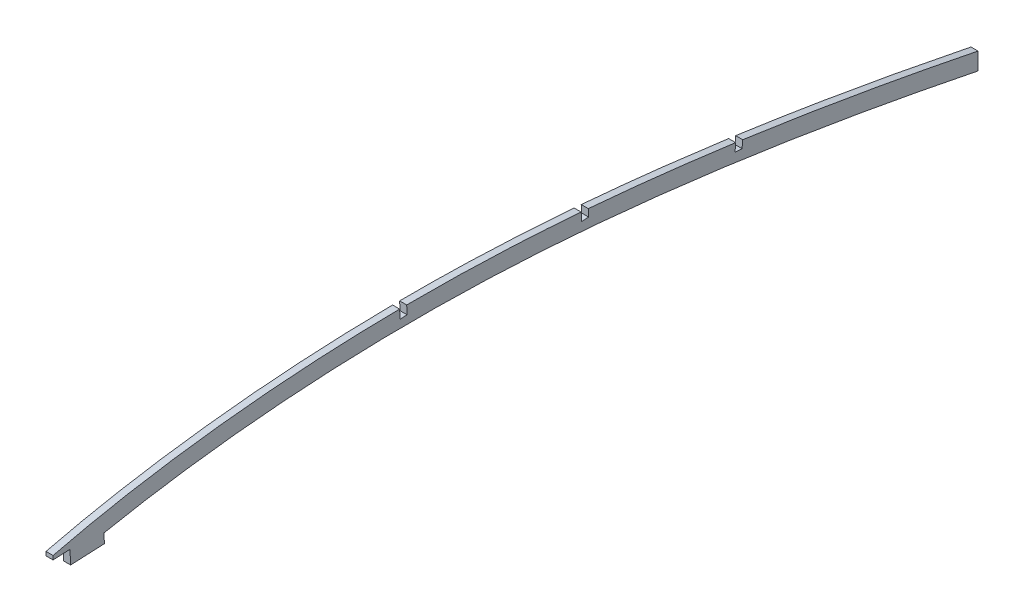
ISO-10303-21;
HEADER;
FILE_DESCRIPTION(('STEP AP214'),'2;1');
FILE_NAME('part.step','',(''),(''),'','','');
FILE_SCHEMA(('AUTOMOTIVE_DESIGN { 1 0 10303 214 1 1 1 1 }'));
ENDSEC;
DATA;
#1=APPLICATION_CONTEXT('core data for automotive mechanical design processes');
#2=APPLICATION_PROTOCOL_DEFINITION('international standard','automotive_design',2000,#1);
#3=PRODUCT_CONTEXT('',#1,'mechanical');
#4=PRODUCT('Part','Part','',(#3));
#5=PRODUCT_RELATED_PRODUCT_CATEGORY('part','',(#4));
#6=PRODUCT_DEFINITION_FORMATION('','',#4);
#7=PRODUCT_DEFINITION_CONTEXT('part definition',#1,'design');
#8=PRODUCT_DEFINITION('design','',#6,#7);
#9=PRODUCT_DEFINITION_SHAPE('','',#8);
#10=(LENGTH_UNIT() NAMED_UNIT(*) SI_UNIT(.MILLI.,.METRE.));
#11=(NAMED_UNIT(*) PLANE_ANGLE_UNIT() SI_UNIT($,.RADIAN.));
#12=(NAMED_UNIT(*) SI_UNIT($,.STERADIAN.) SOLID_ANGLE_UNIT());
#13=UNCERTAINTY_MEASURE_WITH_UNIT(LENGTH_MEASURE(1.E-05),#10,'distance_accuracy_value','');
#14=(GEOMETRIC_REPRESENTATION_CONTEXT(3) GLOBAL_UNCERTAINTY_ASSIGNED_CONTEXT((#13)) GLOBAL_UNIT_ASSIGNED_CONTEXT((#10,
#11,#12)) REPRESENTATION_CONTEXT('',''));
#15=CARTESIAN_POINT('',(0.,0.,0.));
#16=DIRECTION('',(0.,0.,1.));
#17=DIRECTION('',(1.,0.,0.));
#18=AXIS2_PLACEMENT_3D('',#15,#16,#17);
#19=CARTESIAN_POINT('',(269.875,52.8824527941314,-93.4820296364116));
#20=CARTESIAN_POINT('',(269.875,54.4472214890438,-99.166634173712));
#21=CARTESIAN_POINT('',(269.875,55.8952752171336,-104.893555851583));
#22=CARTESIAN_POINT('',(269.875,58.5882568640223,-116.420679251327));
#23=CARTESIAN_POINT('',(269.875,59.826974292918,-122.190022223465));
#24=CARTESIAN_POINT('',(269.875,62.117087477387,-133.738756636561));
#25=CARTESIAN_POINT('',(269.875,63.1681627081713,-139.518165271383));
#26=CARTESIAN_POINT('',(269.875,65.106240842358,-151.085783848621));
#27=CARTESIAN_POINT('',(269.875,65.9929178538776,-156.874011272807));
#28=CARTESIAN_POINT('',(269.875,67.6156294291258,-168.458547011728));
#29=CARTESIAN_POINT('',(269.875,68.3520037975573,-174.25483709837));
#30=CARTESIAN_POINT('',(269.875,69.6857004962886,-185.854876419572));
#31=CARTESIAN_POINT('',(269.875,70.2822091929089,-191.658669299763));
#32=CARTESIAN_POINT('',(269.875,71.8634346581939,-209.081221779935));
#33=CARTESIAN_POINT('',(269.875,72.6363621189132,-220.711342362443));
#34=CARTESIAN_POINT('',(269.875,73.668934014443,-243.99911749291));
#35=CARTESIAN_POINT('',(269.875,73.9324453958394,-255.656564606826));
#36=CARTESIAN_POINT('',(269.875,73.9824135258983,-278.997049405773));
#37=CARTESIAN_POINT('',(269.875,73.7685164688229,-290.680106069953));
#38=CARTESIAN_POINT('',(269.875,73.0982310471271,-308.223436015673));
#39=CARTESIAN_POINT('',(269.875,72.8162417873696,-314.074354031822));
#40=CARTESIAN_POINT('',(269.875,72.1375256290709,-325.782344918309));
#41=CARTESIAN_POINT('',(269.875,71.7415229816649,-331.639378937751));
#42=CARTESIAN_POINT('',(269.875,70.8479701224303,-343.358894277616));
#43=CARTESIAN_POINT('',(269.875,70.3501593439524,-349.224214270375));
#44=CARTESIAN_POINT('',(269.875,69.2661488999765,-360.945617688858));
#45=CARTESIAN_POINT('',(269.875,68.6800828643681,-366.799040842759));
#46=CARTESIAN_POINT('',(269.875,65.5419665798728,-396.031831720138));
#47=CARTESIAN_POINT('',(269.875,62.3661808745333,-419.308162466672));
#48=CARTESIAN_POINT('',(269.875,55.0045904591675,-465.693975492457));
#49=CARTESIAN_POINT('',(269.875,50.8181471638684,-488.803352281641));
#50=CARTESIAN_POINT('',(269.875,43.9657521284985,-523.372806237664));
#51=CARTESIAN_POINT('',(269.875,41.5857568400827,-534.880121521258));
#52=CARTESIAN_POINT('',(269.875,36.6606368596454,-557.867473801833));
#53=CARTESIAN_POINT('',(269.875,34.1150801832616,-569.349788553933));
#54=CARTESIAN_POINT('',(269.875,26.2725045884514,-603.740429881824));
#55=CARTESIAN_POINT('',(269.875,20.7736010749945,-626.59550763983));
#56=CARTESIAN_POINT('',(269.875,15.0714949918691,-649.396489798407));
#57=B_SPLINE_CURVE_WITH_KNOTS('',3,(#19,#20,#21,#22,#23,#24,#25,#26,#27,#28,#29,#30,#31,#32,#33,
#34,#35,#36,#37,#38,#39,#40,#41,#42,#43,#44,#45,#46,#47,#48,#49,#50,#51,#52,#53,#54,#55,#56),
.UNSPECIFIED.,.F.,.F.,(4,2,2,2,2,2,2,2,2,2,2,2,2,2,2,2,2,2,4),(0.,0.0312500000000001,
0.0625000000000002,0.0937500000000003,0.125,0.15625,0.187500000000001,0.250000000000001,
0.312500000000001,0.375000000000001,0.406250000000001,0.437500000000001,0.468750000000001,
0.500000000000001,0.625,0.75,0.8125,0.875,1.),.UNSPECIFIED.);
#58=DIRECTION('',(-1.,0.,0.));
#59=VECTOR('',#58,1.);
#60=SURFACE_OF_LINEAR_EXTRUSION('',#57,#59);
#61=CARTESIAN_POINT('',(269.875,63.1636014489678,-412.368389215458));
#62=DIRECTION('',(-1.,0.,0.));
#63=VECTOR('',#62,1.);
#64=LINE('',#61,#63);
#65=CARTESIAN_POINT('',(266.7,63.1637216101182,-412.367000238022));
#66=VERTEX_POINT('',#65);
#67=CARTESIAN_POINT('',(269.875,63.1637055899343,-412.367465025115));
#68=VERTEX_POINT('',#67);
#69=EDGE_CURVE('E229',#66,#68,#64,.F.);
#70=ORIENTED_EDGE('',*,*,#69,.F.);
#71=CARTESIAN_POINT('',(266.7,63.1637286478879,-412.367468304913));
#72=CARTESIAN_POINT('',(266.7,64.9881137918363,-399.159026230036));
#73=CARTESIAN_POINT('',(266.7,66.6274616288829,-385.920017214436));
#74=CARTESIAN_POINT('',(266.7,68.6800828643681,-366.799040842759));
#75=CARTESIAN_POINT('',(266.7,69.2661488999765,-360.945617688858));
#76=CARTESIAN_POINT('',(266.7,70.0886970791991,-352.051405374405));
#77=CARTESIAN_POINT('',(266.7,70.3573998246843,-349.016657476664));
#78=CARTESIAN_POINT('',(266.7,70.6133138574234,-345.982084047927));
#79=B_SPLINE_CURVE_WITH_KNOTS('',3,(#71,#72,#73,#74,#75,#76,#77,#78),.UNSPECIFIED.,.F.,.F.,(4,2,
2,4),(0.452574939211052,0.523527037211429,0.554777037211429,0.570952098000378),.UNSPECIFIED.);
#80=CARTESIAN_POINT('',(266.7,70.6134547300516,-345.982089740977));
#81=VERTEX_POINT('',#80);
#82=EDGE_CURVE('E426',#81,#66,#79,.F.);
#83=ORIENTED_EDGE('',*,*,#82,.F.);
#84=DIRECTION('',(-1.,0.,0.));
#85=VECTOR('',#84,1.);
#86=CARTESIAN_POINT('',(269.875,70.613312820133,-345.982096347892));
#87=LINE('',#86,#85);
#88=CARTESIAN_POINT('',(269.875,70.6134089604444,-345.982091874072));
#89=VERTEX_POINT('',#88);
#90=EDGE_CURVE('E64',#89,#81,#87,.T.);
#91=ORIENTED_EDGE('',*,*,#90,.F.);
#92=CARTESIAN_POINT('',(269.875,70.6133138735242,-345.982083857006));
#93=CARTESIAN_POINT('',(269.875,70.3573998359546,-349.016657349376));
#94=CARTESIAN_POINT('',(269.875,70.0886970850826,-352.051405310787));
#95=CARTESIAN_POINT('',(269.875,69.2661488999765,-360.945617688858));
#96=CARTESIAN_POINT('',(269.875,68.6800828643681,-366.799040842759));
#97=CARTESIAN_POINT('',(269.875,66.6274616322468,-385.920017183099));
#98=CARTESIAN_POINT('',(269.875,64.9881137995763,-399.15902616753));
#99=CARTESIAN_POINT('',(269.875,63.1637286608083,-412.36746821137));
#100=B_SPLINE_CURVE_WITH_KNOTS('',3,(#92,#93,#94,#95,#96,#97,#98,#99),.UNSPECIFIED.,.F.,.F.,(4,
2,2,4),(0.452574938871833,0.468750000000001,0.500000000000001,0.570952097832882),.UNSPECIFIED.);
#101=EDGE_CURVE('E466',#89,#68,#100,.T.);
#102=ORIENTED_EDGE('',*,*,#101,.T.);
#103=EDGE_LOOP('',(#70,#83,#91,#102));
#104=FACE_BOUND('',#103,.T.);
#105=ADVANCED_FACE('F37',(#104),#60,.T.);
#106=DIRECTION('',(1.,0.,0.));
#107=VECTOR('',#106,1.);
#108=CARTESIAN_POINT('',(266.69,70.8776589017377,-342.791359418603));
#109=LINE('',#108,#107);
#110=CARTESIAN_POINT('',(266.7,70.8776587386429,-342.79138615745));
#111=VERTEX_POINT('',#110);
#112=CARTESIAN_POINT('',(269.875,70.87766066702,-342.791397270465));
#113=VERTEX_POINT('',#112);
#114=EDGE_CURVE('E206',#111,#113,#109,.T.);
#115=ORIENTED_EDGE('',*,*,#114,.F.);
#116=CARTESIAN_POINT('',(266.7,70.8776487016724,-342.791412093076));
#117=CARTESIAN_POINT('',(266.7,71.0211801916106,-341.027001429495));
#118=CARTESIAN_POINT('',(266.7,71.160274973924,-339.262817073039));
#119=CARTESIAN_POINT('',(266.7,71.7415229816649,-331.639378937751));
#120=CARTESIAN_POINT('',(266.7,72.1375256290709,-325.782344918309));
#121=CARTESIAN_POINT('',(266.7,72.8162417873696,-314.074354031822));
#122=CARTESIAN_POINT('',(266.7,73.0982310471271,-308.223436015673));
#123=CARTESIAN_POINT('',(266.7,73.7685164688229,-290.680106069953));
#124=CARTESIAN_POINT('',(266.7,73.9824135258983,-278.997049405773));
#125=CARTESIAN_POINT('',(266.7,73.9551834463134,-266.277676920258));
#126=CARTESIAN_POINT('',(266.7,73.9510097423922,-265.228650240972));
#127=CARTESIAN_POINT('',(266.7,73.9448979981735,-264.179727523695));
#128=B_SPLINE_CURVE_WITH_KNOTS('',3,(#116,#117,#118,#119,#120,#121,#122,#123,#124,#125,#126,
#127),.UNSPECIFIED.,.F.,.F.,(4,2,2,2,2,4),(0.306881382311258,0.316287063850814,
0.347537063850814,0.378787063850814,0.441287063850814,0.446905681539557),.UNSPECIFIED.);
#129=CARTESIAN_POINT('',(266.7,73.9449176927139,-264.179727408972));
#130=VERTEX_POINT('',#129);
#131=EDGE_CURVE('E511',#130,#111,#128,.F.);
#132=ORIENTED_EDGE('',*,*,#131,.F.);
#133=DIRECTION('',(-1.,0.,0.));
#134=VECTOR('',#133,1.);
#135=CARTESIAN_POINT('',(269.875,73.9448980044007,-264.179728592424));
#136=LINE('',#135,#134);
#137=CARTESIAN_POINT('',(269.875,73.9449093637791,-264.179728063824));
#138=VERTEX_POINT('',#137);
#139=EDGE_CURVE('E212',#138,#130,#136,.T.);
#140=ORIENTED_EDGE('',*,*,#139,.F.);
#141=CARTESIAN_POINT('',(269.875,73.9448979990121,-264.179727667621));
#142=CARTESIAN_POINT('',(269.875,73.951009742774,-265.228650336932));
#143=CARTESIAN_POINT('',(269.875,73.9551834464162,-266.277676968243));
#144=CARTESIAN_POINT('',(269.875,73.9824135258983,-278.997049405773));
#145=CARTESIAN_POINT('',(269.875,73.7685164688229,-290.680106069953));
#146=CARTESIAN_POINT('',(269.875,73.0982310471271,-308.223436015673));
#147=CARTESIAN_POINT('',(269.875,72.8162417873696,-314.074354031822));
#148=CARTESIAN_POINT('',(269.875,72.1375256290709,-325.782344918309));
#149=CARTESIAN_POINT('',(269.875,71.7415229816649,-331.639378937751));
#150=CARTESIAN_POINT('',(269.875,71.1602753725587,-339.262811844691));
#151=CARTESIAN_POINT('',(269.875,71.0211810162905,-341.026990969811));
#152=CARTESIAN_POINT('',(269.875,70.8776499781494,-342.791396401537));
#153=B_SPLINE_CURVE_WITH_KNOTS('',3,(#141,#142,#143,#144,#145,#146,#147,#148,#149,#150,#151,
#152),.UNSPECIFIED.,.F.,.F.,(4,2,2,2,2,4),(0.30688138256824,0.312500000000001,0.375000000000001,
0.406250000000001,0.437500000000001,0.446905653656855),.UNSPECIFIED.);
#154=EDGE_CURVE('E304',#138,#113,#153,.T.);
#155=ORIENTED_EDGE('',*,*,#154,.T.);
#156=EDGE_LOOP('',(#115,#132,#140,#155));
#157=FACE_BOUND('',#156,.T.);
#158=ADVANCED_FACE('F460',(#157),#60,.T.);
#159=CARTESIAN_POINT('',(269.875,73.920466115459,-261.00477321921));
#160=DIRECTION('',(-1.,0.,0.));
#161=VECTOR('',#160,1.);
#162=LINE('',#159,#161);
#163=CARTESIAN_POINT('',(266.7,73.9204061894087,-261.003020246642));
#164=VERTEX_POINT('',#163);
#165=CARTESIAN_POINT('',(269.875,73.9204549058227,-261.003602000397));
#166=VERTEX_POINT('',#165);
#167=EDGE_CURVE('E227',#164,#166,#162,.F.);
#168=ORIENTED_EDGE('',*,*,#167,.F.);
#169=CARTESIAN_POINT('',(266.7,73.9204549444265,-261.003605691977));
#170=CARTESIAN_POINT('',(266.7,73.8289936340344,-251.445324232492));
#171=CARTESIAN_POINT('',(266.7,73.5756703414111,-241.895725511383));
#172=CARTESIAN_POINT('',(266.7,72.6363621189132,-220.711342362443));
#173=CARTESIAN_POINT('',(266.7,71.8634346581939,-209.081221779935));
#174=CARTESIAN_POINT('',(266.7,70.2822091929089,-191.658669299763));
#175=CARTESIAN_POINT('',(266.7,69.6857004962886,-185.854876419572));
#176=CARTESIAN_POINT('',(266.7,68.3520037975573,-174.25483709837));
#177=CARTESIAN_POINT('',(266.7,67.6156294291258,-168.458547011728));
#178=CARTESIAN_POINT('',(266.7,65.9929178538776,-156.874011272807));
#179=CARTESIAN_POINT('',(266.7,65.106240842358,-151.085783848621));
#180=CARTESIAN_POINT('',(266.7,63.1681627081713,-139.518165271383));
#181=CARTESIAN_POINT('',(266.7,62.117087477387,-133.738756636561));
#182=CARTESIAN_POINT('',(266.7,59.826974292918,-122.190022223465));
#183=CARTESIAN_POINT('',(266.7,58.5882568640223,-116.420679251327));
#184=CARTESIAN_POINT('',(266.7,56.7917983054366,-108.731061495755));
#185=CARTESIAN_POINT('',(266.7,56.3304885331624,-106.809097214425));
#186=CARTESIAN_POINT('',(266.7,55.8572712588303,-104.891436573769));
#187=B_SPLINE_CURVE_WITH_KNOTS('',3,(#169,#170,#171,#172,#173,#174,#175,#176,#177,#178,#179,
#180,#181,#182,#183,#184,#185,#186),.UNSPECIFIED.,.F.,.F.,(4,2,2,2,2,2,2,2,4),
(0.0208069346048744,0.072016719192805,0.134516719192805,0.165766719192805,0.197016719192805,
0.228266719192805,0.259516719192806,0.290766719192806,0.301209784587931),.UNSPECIFIED.);
#188=CARTESIAN_POINT('',(266.7,55.8572712588303,-104.891436573769));
#189=VERTEX_POINT('',#188);
#190=EDGE_CURVE('E271',#189,#164,#187,.F.);
#191=ORIENTED_EDGE('',*,*,#190,.F.);
#192=DIRECTION('',(-1.,0.,0.));
#193=VECTOR('',#192,1.);
#194=CARTESIAN_POINT('',(269.875,55.8572712588303,-104.891436573769));
#195=LINE('',#194,#193);
#196=CARTESIAN_POINT('',(269.875,55.8572712588303,-104.891436573769));
#197=VERTEX_POINT('',#196);
#198=EDGE_CURVE('E387',#197,#189,#195,.T.);
#199=ORIENTED_EDGE('',*,*,#198,.F.);
#200=CARTESIAN_POINT('',(269.875,55.8572712588303,-104.891436573769));
#201=CARTESIAN_POINT('',(269.875,56.3304885331624,-106.809097214425));
#202=CARTESIAN_POINT('',(269.875,56.7917983054366,-108.731061495755));
#203=CARTESIAN_POINT('',(269.875,58.5882568640223,-116.420679251327));
#204=CARTESIAN_POINT('',(269.875,59.826974292918,-122.190022223465));
#205=CARTESIAN_POINT('',(269.875,62.117087477387,-133.738756636561));
#206=CARTESIAN_POINT('',(269.875,63.1681627081713,-139.518165271383));
#207=CARTESIAN_POINT('',(269.875,65.106240842358,-151.085783848621));
#208=CARTESIAN_POINT('',(269.875,65.9929178538776,-156.874011272807));
#209=CARTESIAN_POINT('',(269.875,67.6156294291258,-168.458547011728));
#210=CARTESIAN_POINT('',(269.875,68.3520037975573,-174.25483709837));
#211=CARTESIAN_POINT('',(269.875,69.6857004962886,-185.854876419572));
#212=CARTESIAN_POINT('',(269.875,70.2822091929089,-191.658669299763));
#213=CARTESIAN_POINT('',(269.875,71.8634346581939,-209.081221779935));
#214=CARTESIAN_POINT('',(269.875,72.6363621189132,-220.711342362443));
#215=CARTESIAN_POINT('',(269.875,73.575670286951,-241.895724283136));
#216=CARTESIAN_POINT('',(269.875,73.8289935688085,-251.445321773653));
#217=CARTESIAN_POINT('',(269.875,73.9204549091022,-261.003602000365));
#218=B_SPLINE_CURVE_WITH_KNOTS('',3,(#200,#201,#202,#203,#204,#205,#206,#207,#208,#209,#210,
#211,#212,#213,#214,#215,#216,#217),.UNSPECIFIED.,.F.,.F.,(4,2,2,2,2,2,2,2,4),
(0.0208069346048744,0.0312500000000001,0.0625000000000002,0.0937500000000003,0.125,0.15625,
0.187500000000001,0.250000000000001,0.301209777995162),.UNSPECIFIED.);
#219=EDGE_CURVE('E495',#197,#166,#218,.T.);
#220=ORIENTED_EDGE('',*,*,#219,.T.);
#221=EDGE_LOOP('',(#168,#191,#199,#220));
#222=FACE_BOUND('',#221,.T.);
#223=ADVANCED_FACE('F330',(#222),#60,.T.);
#224=CARTESIAN_POINT('',(269.875,6.05049634885918,-130.020158954091));
#225=DIRECTION('',(0.,-0.0464847590307228,0.998918999307679));
#226=DIRECTION('',(0.,-0.99891899930768,-0.0464847590307228));
#227=AXIS2_PLACEMENT_3D('',#224,#225,#226);
#228=PLANE('',#227);
#229=DIRECTION('',(0.,0.998918999307679,0.0464847590307228));
#230=VECTOR('',#229,1.);
#231=CARTESIAN_POINT('',(266.7,6.05049634885918,-130.020158954091));
#232=LINE('',#231,#230);
#233=CARTESIAN_POINT('',(266.7,48.881499990872,-128.027015481274));
#234=VERTEX_POINT('',#233);
#235=CARTESIAN_POINT('',(266.7,53.173935834317,-127.827266706873));
#236=VERTEX_POINT('',#235);
#237=EDGE_CURVE('E358',#234,#236,#232,.T.);
#238=ORIENTED_EDGE('',*,*,#237,.T.);
#239=DIRECTION('',(-1.,0.,0.));
#240=VECTOR('',#239,1.);
#241=CARTESIAN_POINT('',(269.875,53.173935834317,-127.827266706873));
#242=LINE('',#241,#240);
#243=CARTESIAN_POINT('',(269.875,53.173935834317,-127.827266706873));
#244=VERTEX_POINT('',#243);
#245=EDGE_CURVE('E390',#244,#236,#242,.T.);
#246=ORIENTED_EDGE('',*,*,#245,.F.);
#247=DIRECTION('',(0.,0.998918999307679,0.0464847590307228));
#248=VECTOR('',#247,1.);
#249=CARTESIAN_POINT('',(269.875,6.05049634885918,-130.020158954091));
#250=LINE('',#249,#248);
#251=CARTESIAN_POINT('',(269.875,48.881499990872,-128.027015481274));
#252=VERTEX_POINT('',#251);
#253=EDGE_CURVE('E379',#252,#244,#250,.T.);
#254=ORIENTED_EDGE('',*,*,#253,.F.);
#255=DIRECTION('',(-1.,0.,0.));
#256=VECTOR('',#255,1.);
#257=CARTESIAN_POINT('',(269.875,48.881499990872,-128.027015481274));
#258=LINE('',#257,#256);
#259=EDGE_CURVE('E357',#252,#234,#258,.T.);
#260=ORIENTED_EDGE('',*,*,#259,.T.);
#261=EDGE_LOOP('',(#238,#246,#254,#260));
#262=FACE_BOUND('',#261,.T.);
#263=ADVANCED_FACE('F39',(#262),#228,.F.);
#264=CARTESIAN_POINT('',(269.875,48.4592558317324,-106.717030845934));
#265=CARTESIAN_POINT('',(269.875,49.8245095545002,-112.249566556856));
#266=CARTESIAN_POINT('',(269.875,52.3522068408445,-123.377135499135));
#267=CARTESIAN_POINT('',(269.875,56.6673013608639,-145.693145591552));
#268=CARTESIAN_POINT('',(269.875,60.8548874858256,-173.722026173825));
#269=CARTESIAN_POINT('',(269.875,64.2678136075331,-207.468481867203));
#270=CARTESIAN_POINT('',(269.875,66.1126762808012,-241.316867464787));
#271=CARTESIAN_POINT('',(269.875,66.5416270166189,-275.274956705987));
#272=CARTESIAN_POINT('',(269.875,65.6252366214944,-309.305825998354));
#273=CARTESIAN_POINT('',(269.875,63.3616727877156,-343.445172150241));
#274=CARTESIAN_POINT('',(269.875,58.8709078863322,-389.065328755951));
#275=CARTESIAN_POINT('',(269.875,50.9453406543752,-445.687567425152));
#276=CARTESIAN_POINT('',(269.875,38.5693679111229,-513.280196478384));
#277=CARTESIAN_POINT('',(269.875,24.0082767381778,-580.599535188199));
#278=CARTESIAN_POINT('',(269.875,13.2512999852653,-625.267095621691));
#279=CARTESIAN_POINT('',(269.875,7.67929880608075,-647.547843611076));
#280=B_SPLINE_CURVE_WITH_KNOTS('',3,(#264,#265,#266,#267,#268,#269,#270,#271,#272,#273,#274,
#275,#276,#277,#278,#279),.UNSPECIFIED.,.F.,.F.,(4,1,1,1,1,1,1,1,1,1,1,1,1,4),
(0.0208069346048739,0.0514067178984716,0.0820065011920693,0.143206067779265,0.20440563436646,
0.265605200953656,0.326804767540851,0.388004334128046,0.449203900715242,0.510403467302437,
0.632802600476828,0.755201733651219,0.87760086682561,1.),.UNSPECIFIED.);
#281=DIRECTION('',(-1.,0.,0.));
#282=VECTOR('',#281,1.);
#283=SURFACE_OF_LINEAR_EXTRUSION('',#280,#282);
#284=CARTESIAN_POINT('',(266.7,48.4592558317324,-106.717030845934));
#285=CARTESIAN_POINT('',(266.7,49.8245095545002,-112.249566556856));
#286=CARTESIAN_POINT('',(266.7,52.3522068408445,-123.377135499135));
#287=CARTESIAN_POINT('',(266.7,56.6673013608639,-145.693145591552));
#288=CARTESIAN_POINT('',(266.7,60.8548874858256,-173.722026173825));
#289=CARTESIAN_POINT('',(266.7,64.2678136075331,-207.468481867203));
#290=CARTESIAN_POINT('',(266.7,66.1126762808012,-241.316867464787));
#291=CARTESIAN_POINT('',(266.7,66.5416270166189,-275.274956705987));
#292=CARTESIAN_POINT('',(266.7,65.6252366214944,-309.305825998354));
#293=CARTESIAN_POINT('',(266.7,63.3616727877156,-343.445172150241));
#294=CARTESIAN_POINT('',(266.7,58.8709078863322,-389.065328755951));
#295=CARTESIAN_POINT('',(266.7,50.9453406543752,-445.687567425152));
#296=CARTESIAN_POINT('',(266.7,38.5693679111229,-513.280196478384));
#297=CARTESIAN_POINT('',(266.7,24.0082767381778,-580.599535188199));
#298=CARTESIAN_POINT('',(266.7,13.2512999852653,-625.267095621691));
#299=CARTESIAN_POINT('',(266.7,7.67929880608075,-647.547843611076));
#300=B_SPLINE_CURVE_WITH_KNOTS('',3,(#284,#285,#286,#287,#288,#289,#290,#291,#292,#293,#294,
#295,#296,#297,#298,#299),.UNSPECIFIED.,.F.,.F.,(4,1,1,1,1,1,1,1,1,1,1,1,1,4),
(0.0208069346048739,0.0514067178984716,0.0820065011920693,0.143206067779265,0.20440563436646,
0.265605200953656,0.326804767540851,0.388004334128046,0.449203900715242,0.510403467302437,
0.632802600476828,0.755201733651219,0.87760086682561,1.),.UNSPECIFIED.);
#301=CARTESIAN_POINT('',(266.7,36.5326981972531,-521.527266706873));
#302=VERTEX_POINT('',#301);
#303=EDGE_CURVE('E361',#236,#302,#300,.T.);
#304=ORIENTED_EDGE('',*,*,#303,.T.);
#305=DIRECTION('',(-1.,0.,0.));
#306=VECTOR('',#305,1.);
#307=CARTESIAN_POINT('',(269.875,36.5326981972531,-521.527266706873));
#308=LINE('',#307,#306);
#309=CARTESIAN_POINT('',(269.875,36.5326981972531,-521.527266706873));
#310=VERTEX_POINT('',#309);
#311=EDGE_CURVE('E388',#310,#302,#308,.T.);
#312=ORIENTED_EDGE('',*,*,#311,.F.);
#313=EDGE_CURVE('E339',#244,#310,#280,.T.);
#314=ORIENTED_EDGE('',*,*,#313,.F.);
#315=ORIENTED_EDGE('',*,*,#245,.T.);
#316=EDGE_LOOP('',(#304,#312,#314,#315));
#317=FACE_BOUND('',#316,.T.);
#318=ADVANCED_FACE('F669',(#317),#283,.F.);
#319=CARTESIAN_POINT('',(269.875,-1.34032420085458E-10,-521.527266706863));
#320=DIRECTION('',(0.,2.56999832303676E-13,1.));
#321=DIRECTION('',(0.,-1.,2.56999832303676E-13));
#322=AXIS2_PLACEMENT_3D('',#319,#320,#321);
#323=PLANE('',#322);
#324=DIRECTION('',(0.,1.,-2.56999832303676E-13));
#325=VECTOR('',#324,1.);
#326=CARTESIAN_POINT('',(266.7,-1.34032420085458E-10,-521.527266706863));
#327=LINE('',#326,#325);
#328=CARTESIAN_POINT('',(266.7,44.3085843774586,-521.527266706875));
#329=VERTEX_POINT('',#328);
#330=EDGE_CURVE('E365',#302,#329,#327,.T.);
#331=ORIENTED_EDGE('',*,*,#330,.T.);
#332=DIRECTION('',(-1.,0.,0.));
#333=VECTOR('',#332,1.);
#334=CARTESIAN_POINT('',(269.875,44.3085843774586,-521.527266706875));
#335=LINE('',#334,#333);
#336=CARTESIAN_POINT('',(269.875,44.3085843774586,-521.527266706875));
#337=VERTEX_POINT('',#336);
#338=EDGE_CURVE('E391',#337,#329,#335,.T.);
#339=ORIENTED_EDGE('',*,*,#338,.F.);
#340=DIRECTION('',(0.,1.,-2.56999832303676E-13));
#341=VECTOR('',#340,1.);
#342=CARTESIAN_POINT('',(269.875,-1.34032420085458E-10,-521.527266706863));
#343=LINE('',#342,#341);
#344=EDGE_CURVE('E496',#310,#337,#343,.T.);
#345=ORIENTED_EDGE('',*,*,#344,.F.);
#346=ORIENTED_EDGE('',*,*,#311,.T.);
#347=EDGE_LOOP('',(#331,#339,#345,#346));
#348=FACE_BOUND('',#347,.T.);
#349=ADVANCED_FACE('F328',(#348),#323,.F.);
#350=DIRECTION('',(-1.,0.,0.));
#351=VECTOR('',#350,1.);
#352=CARTESIAN_POINT('',(269.875,62.7250358360656,-415.517697510942));
#353=LINE('',#352,#351);
#354=CARTESIAN_POINT('',(269.875,62.7250266159253,-415.517696826152));
#355=VERTEX_POINT('',#354);
#356=CARTESIAN_POINT('',(266.7,62.7250303956623,-415.517697460134));
#357=VERTEX_POINT('',#356);
#358=EDGE_CURVE('E56',#355,#357,#353,.T.);
#359=ORIENTED_EDGE('',*,*,#358,.F.);
#360=CARTESIAN_POINT('',(269.875,62.7250357521386,-415.517698108765));
#361=CARTESIAN_POINT('',(269.875,61.4604232980261,-424.525690611687));
#362=CARTESIAN_POINT('',(269.875,60.1107705809776,-433.519635024957));
#363=CARTESIAN_POINT('',(269.875,55.0045904591675,-465.693975492457));
#364=CARTESIAN_POINT('',(269.875,50.8181471638684,-488.803352281641));
#365=CARTESIAN_POINT('',(269.875,45.6102051975167,-515.076751448231));
#366=CARTESIAN_POINT('',(269.875,44.9630080195597,-518.302605959622));
#367=CARTESIAN_POINT('',(269.875,44.3085843774585,-521.527266706875));
#368=B_SPLINE_CURVE_WITH_KNOTS('',3,(#360,#361,#362,#363,#364,#365,#366,#367),.UNSPECIFIED.,.F.,
.F.,(4,2,2,4),(0.576593852900591,0.625,0.75,0.767503331120084),.UNSPECIFIED.);
#369=EDGE_CURVE('E199',#355,#337,#368,.T.);
#370=ORIENTED_EDGE('',*,*,#369,.T.);
#371=ORIENTED_EDGE('',*,*,#338,.T.);
#372=CARTESIAN_POINT('',(266.7,44.3085843774585,-521.527266706875));
#373=CARTESIAN_POINT('',(266.7,44.9630080195597,-518.302605959622));
#374=CARTESIAN_POINT('',(266.7,45.6102051975167,-515.076751448231));
#375=CARTESIAN_POINT('',(266.7,50.8181471638684,-488.803352281641));
#376=CARTESIAN_POINT('',(266.7,55.0045904591675,-465.693975492457));
#377=CARTESIAN_POINT('',(266.7,60.1107705756316,-433.519635058643));
#378=CARTESIAN_POINT('',(266.7,61.4604232879021,-424.525690679152));
#379=CARTESIAN_POINT('',(266.7,62.7250357379094,-415.517698210121));
#380=B_SPLINE_CURVE_WITH_KNOTS('',3,(#372,#373,#374,#375,#376,#377,#378,#379),.UNSPECIFIED.,.F.,
.F.,(4,2,2,4),(0.576593853082143,0.594097184202227,0.719097184202227,0.767503331120084),.UNSPECIFIED.);
#381=EDGE_CURVE('E404',#357,#329,#380,.F.);
#382=ORIENTED_EDGE('',*,*,#381,.F.);
#383=EDGE_LOOP('',(#359,#370,#371,#382));
#384=FACE_BOUND('',#383,.T.);
#385=ADVANCED_FACE('F316',(#384),#60,.T.);
#386=CARTESIAN_POINT('',(269.875,-1.07348954909661E-11,-104.891436573764));
#387=DIRECTION('',(0.,1.0234291608178E-13,1.));
#388=DIRECTION('',(0.,-1.,1.0234291608178E-13));
#389=AXIS2_PLACEMENT_3D('',#386,#387,#388);
#390=PLANE('',#389);
#391=DIRECTION('',(0.,1.,-1.0234291608178E-13));
#392=VECTOR('',#391,1.);
#393=CARTESIAN_POINT('',(266.7,-1.07348954909661E-11,-104.891436573764));
#394=LINE('',#393,#392);
#395=CARTESIAN_POINT('',(266.7,54.0944600315498,-104.891436573769));
#396=VERTEX_POINT('',#395);
#397=EDGE_CURVE('E373',#396,#189,#394,.T.);
#398=ORIENTED_EDGE('',*,*,#397,.F.);
#399=DIRECTION('',(-1.,0.,0.));
#400=VECTOR('',#399,1.);
#401=CARTESIAN_POINT('',(269.875,54.0944600315498,-104.891436573769));
#402=LINE('',#401,#400);
#403=CARTESIAN_POINT('',(269.875,54.0944600315498,-104.891436573769));
#404=VERTEX_POINT('',#403);
#405=EDGE_CURVE('E385',#404,#396,#402,.T.);
#406=ORIENTED_EDGE('',*,*,#405,.F.);
#407=DIRECTION('',(0.,1.,-1.0234291608178E-13));
#408=VECTOR('',#407,1.);
#409=CARTESIAN_POINT('',(269.875,-1.07348954909661E-11,-104.891436573764));
#410=LINE('',#409,#408);
#411=EDGE_CURVE('E351',#404,#197,#410,.T.);
#412=ORIENTED_EDGE('',*,*,#411,.T.);
#413=ORIENTED_EDGE('',*,*,#198,.T.);
#414=EDGE_LOOP('',(#398,#406,#412,#413));
#415=FACE_BOUND('',#414,.T.);
#416=ADVANCED_FACE('F327',(#415),#390,.T.);
#417=CARTESIAN_POINT('',(269.875,49.1069885939337,2.28519683086988));
#418=DIRECTION('',(0.,-0.998918999307679,-0.0464847590307261));
#419=DIRECTION('',(0.,0.0464847590307261,-0.998918999307679));
#420=AXIS2_PLACEMENT_3D('',#417,#418,#419);
#421=PLANE('',#420);
#422=DIRECTION('',(0.,-0.0464847590307262,0.998918999307679));
#423=VECTOR('',#422,1.);
#424=CARTESIAN_POINT('',(266.7,49.1069885939337,2.28519683086988));
#425=LINE('',#424,#423);
#426=CARTESIAN_POINT('',(266.7,54.4490572151649,-112.511436573769));
#427=VERTEX_POINT('',#426);
#428=EDGE_CURVE('E366',#427,#396,#425,.T.);
#429=ORIENTED_EDGE('',*,*,#428,.F.);
#430=DIRECTION('',(-1.,0.,0.));
#431=VECTOR('',#430,1.);
#432=CARTESIAN_POINT('',(269.875,54.4490572151649,-112.511436573769));
#433=LINE('',#432,#431);
#434=CARTESIAN_POINT('',(269.875,54.4490572151649,-112.511436573769));
#435=VERTEX_POINT('',#434);
#436=EDGE_CURVE('E383',#435,#427,#433,.T.);
#437=ORIENTED_EDGE('',*,*,#436,.F.);
#438=DIRECTION('',(0.,-0.0464847590307262,0.998918999307679));
#439=VECTOR('',#438,1.);
#440=CARTESIAN_POINT('',(269.875,49.1069885939337,2.28519683086988));
#441=LINE('',#440,#439);
#442=EDGE_CURVE('E344',#435,#404,#441,.T.);
#443=ORIENTED_EDGE('',*,*,#442,.T.);
#444=ORIENTED_EDGE('',*,*,#405,.T.);
#445=EDGE_LOOP('',(#429,#437,#443,#444));
#446=FACE_BOUND('',#445,.T.);
#447=ADVANCED_FACE('F450',(#446),#421,.T.);
#448=CARTESIAN_POINT('',(269.875,5.34206862128137,-114.796633404658));
#449=DIRECTION('',(0.,-0.046484759031154,0.998918999307659));
#450=DIRECTION('',(0.,-0.998918999307659,-0.046484759031154));
#451=AXIS2_PLACEMENT_3D('',#448,#449,#450);
#452=PLANE('',#451);
#453=DIRECTION('',(0.,0.998918999307659,0.046484759031154));
#454=VECTOR('',#453,1.);
#455=CARTESIAN_POINT('',(266.7,5.34206862128137,-114.796633404658));
#456=LINE('',#455,#454);
#457=CARTESIAN_POINT('',(266.7,48.1730722632438,-112.803489931824));
#458=VERTEX_POINT('',#457);
#459=EDGE_CURVE('E372',#458,#427,#456,.T.);
#460=ORIENTED_EDGE('',*,*,#459,.F.);
#461=DIRECTION('',(-1.,0.,0.));
#462=VECTOR('',#461,1.);
#463=CARTESIAN_POINT('',(269.875,48.1730722632438,-112.803489931824));
#464=LINE('',#463,#462);
#465=CARTESIAN_POINT('',(269.875,48.1730722632438,-112.803489931824));
#466=VERTEX_POINT('',#465);
#467=EDGE_CURVE('E381',#466,#458,#464,.T.);
#468=ORIENTED_EDGE('',*,*,#467,.F.);
#469=DIRECTION('',(0.,0.998918999307659,0.046484759031154));
#470=VECTOR('',#469,1.);
#471=CARTESIAN_POINT('',(269.875,5.34206862128137,-114.796633404658));
#472=LINE('',#471,#470);
#473=EDGE_CURVE('E350',#466,#435,#472,.T.);
#474=ORIENTED_EDGE('',*,*,#473,.T.);
#475=ORIENTED_EDGE('',*,*,#436,.T.);
#476=EDGE_LOOP('',(#460,#468,#474,#475));
#477=FACE_BOUND('',#476,.T.);
#478=ADVANCED_FACE('F447',(#477),#452,.T.);
#479=CARTESIAN_POINT('',(269.875,42.8310036420125,1.99314347281709));
#480=DIRECTION('',(0.,-0.998918999307679,-0.0464847590307257));
#481=DIRECTION('',(0.,0.0464847590307257,-0.998918999307679));
#482=AXIS2_PLACEMENT_3D('',#479,#480,#481);
#483=PLANE('',#482);
#484=DIRECTION('',(0.,-0.0464847590307257,0.998918999307679));
#485=VECTOR('',#484,1.);
#486=CARTESIAN_POINT('',(266.7,42.8310036420125,1.99314347281709));
#487=LINE('',#486,#485);
#488=EDGE_CURVE('E376',#234,#458,#487,.T.);
#489=ORIENTED_EDGE('',*,*,#488,.F.);
#490=ORIENTED_EDGE('',*,*,#259,.F.);
#491=DIRECTION('',(0.,-0.0464847590307257,0.998918999307679));
#492=VECTOR('',#491,1.);
#493=CARTESIAN_POINT('',(269.875,42.8310036420125,1.99314347281709));
#494=LINE('',#493,#492);
#495=EDGE_CURVE('E354',#252,#466,#494,.T.);
#496=ORIENTED_EDGE('',*,*,#495,.T.);
#497=ORIENTED_EDGE('',*,*,#467,.T.);
#498=EDGE_LOOP('',(#489,#490,#496,#497));
#499=FACE_BOUND('',#498,.T.);
#500=ADVANCED_FACE('F444',(#499),#483,.T.);
#501=CARTESIAN_POINT('',(269.875,0.,0.));
#502=DIRECTION('',(1.,0.,0.));
#503=DIRECTION('',(0.,0.,-1.));
#504=AXIS2_PLACEMENT_3D('',#501,#502,#503);
#505=PLANE('',#504);
#506=DIRECTION('',(0.,-0.997253262558021,0.0740670663478917));
#507=VECTOR('',#506,1.);
#508=CARTESIAN_POINT('',(269.875,59.6051711113478,-412.102236909865));
#509=LINE('',#508,#507);
#510=CARTESIAN_POINT('',(269.875,59.6051711113478,-412.102236909865));
#511=VERTEX_POINT('',#510);
#512=EDGE_CURVE('E185',#68,#511,#509,.T.);
#513=ORIENTED_EDGE('',*,*,#512,.F.);
#514=ORIENTED_EDGE('',*,*,#101,.F.);
#515=DIRECTION('',(0.,0.998919035514868,0.0464839809616857));
#516=VECTOR('',#515,1.);
#517=CARTESIAN_POINT('',(269.875,67.2420488566815,-346.138975698793));
#518=LINE('',#517,#516);
#519=CARTESIAN_POINT('',(269.875,67.2420488566815,-346.138975698793));
#520=VERTEX_POINT('',#519);
#521=EDGE_CURVE('E217',#520,#89,#518,.T.);
#522=ORIENTED_EDGE('',*,*,#521,.F.);
#523=DIRECTION('',(0.,0.0464839809616744,-0.998919035514868));
#524=VECTOR('',#523,1.);
#525=CARTESIAN_POINT('',(269.875,67.0944622172322,-342.967407763269));
#526=LINE('',#525,#524);
#527=CARTESIAN_POINT('',(269.875,67.0944622172322,-342.967407763269));
#528=VERTEX_POINT('',#527);
#529=EDGE_CURVE('E214',#528,#520,#526,.T.);
#530=ORIENTED_EDGE('',*,*,#529,.F.);
#531=DIRECTION('',(0.,-0.998919035514868,-0.0464839809616857));
#532=VECTOR('',#531,1.);
#533=CARTESIAN_POINT('',(269.875,70.8776589017377,-342.791359418603));
#534=LINE('',#533,#532);
#535=EDGE_CURVE('E224',#113,#528,#534,.T.);
#536=ORIENTED_EDGE('',*,*,#535,.F.);
#537=ORIENTED_EDGE('',*,*,#154,.F.);
#538=DIRECTION('',(0.,0.998919035514921,0.046483980960538));
#539=VECTOR('',#538,1.);
#540=CARTESIAN_POINT('',(269.875,74.0679439383684,-264.174002738127));
#541=LINE('',#540,#539);
#542=CARTESIAN_POINT('',(269.875,70.0127664241334,-264.362707515653));
#543=VERTEX_POINT('',#542);
#544=EDGE_CURVE('E241',#543,#138,#541,.T.);
#545=ORIENTED_EDGE('',*,*,#544,.F.);
#546=DIRECTION('',(0.,0.0464839809616788,-0.998919035514868));
#547=VECTOR('',#546,1.);
#548=CARTESIAN_POINT('',(269.875,70.0127664241334,-264.362707515653));
#549=LINE('',#548,#547);
#550=CARTESIAN_POINT('',(269.875,69.8651797846841,-261.191139580129));
#551=VERTEX_POINT('',#550);
#552=EDGE_CURVE('E249',#551,#543,#549,.T.);
#553=ORIENTED_EDGE('',*,*,#552,.F.);
#554=DIRECTION('',(0.,-0.998919035514921,-0.046483980960538));
#555=VECTOR('',#554,1.);
#556=CARTESIAN_POINT('',(269.875,69.8651797846841,-261.191139580129));
#557=LINE('',#556,#555);
#558=EDGE_CURVE('E245',#166,#551,#557,.T.);
#559=ORIENTED_EDGE('',*,*,#558,.F.);
#560=ORIENTED_EDGE('',*,*,#219,.F.);
#561=ORIENTED_EDGE('',*,*,#411,.F.);
#562=ORIENTED_EDGE('',*,*,#442,.F.);
#563=ORIENTED_EDGE('',*,*,#473,.F.);
#564=ORIENTED_EDGE('',*,*,#495,.F.);
#565=ORIENTED_EDGE('',*,*,#253,.T.);
#566=ORIENTED_EDGE('',*,*,#313,.T.);
#567=ORIENTED_EDGE('',*,*,#344,.T.);
#568=ORIENTED_EDGE('',*,*,#369,.F.);
#569=DIRECTION('',(0.,0.997253262558021,-0.0740670663478917));
#570=VECTOR('',#569,1.);
#571=CARTESIAN_POINT('',(269.875,62.9285761835817,-415.532814670234));
#572=LINE('',#571,#570);
#573=CARTESIAN_POINT('',(269.875,59.3700081756932,-415.268516018487));
#574=VERTEX_POINT('',#573);
#575=EDGE_CURVE('E180',#574,#355,#572,.T.);
#576=ORIENTED_EDGE('',*,*,#575,.F.);
#577=DIRECTION('',(0.,-0.0740670663478944,-0.997253262558021));
#578=VECTOR('',#577,1.);
#579=CARTESIAN_POINT('',(269.875,59.3700081756932,-415.268516018487));
#580=LINE('',#579,#578);
#581=EDGE_CURVE('E188',#511,#574,#580,.T.);
#582=ORIENTED_EDGE('',*,*,#581,.F.);
#583=EDGE_LOOP('',(#513,#514,#522,#530,#536,#537,#545,#553,#559,#560,#561,#562,#563,#564,#565,
#566,#567,#568,#576,#582));
#584=FACE_BOUND('',#583,.T.);
#585=ADVANCED_FACE('F197',(#584),#505,.T.);
#586=CARTESIAN_POINT('',(266.7,0.,0.));
#587=DIRECTION('',(1.,0.,0.));
#588=DIRECTION('',(0.,0.,-1.));
#589=AXIS2_PLACEMENT_3D('',#586,#587,#588);
#590=PLANE('',#589);
#591=ORIENTED_EDGE('',*,*,#82,.T.);
#592=DIRECTION('',(0.,-0.997253262558021,0.0740670663478917));
#593=VECTOR('',#592,1.);
#594=CARTESIAN_POINT('',(266.7,-30.1123746815291,-405.438818833132));
#595=LINE('',#594,#593);
#596=CARTESIAN_POINT('',(266.7,59.6051711113478,-412.102236909865));
#597=VERTEX_POINT('',#596);
#598=EDGE_CURVE('E11',#66,#597,#595,.T.);
#599=ORIENTED_EDGE('',*,*,#598,.T.);
#600=DIRECTION('',(0.,-0.0740670663478944,-0.997253262558021));
#601=VECTOR('',#600,1.);
#602=CARTESIAN_POINT('',(266.7,89.7175457928779,-6.66341807673427));
#603=LINE('',#602,#601);
#604=CARTESIAN_POINT('',(266.7,59.3700081756932,-415.268516018487));
#605=VERTEX_POINT('',#604);
#606=EDGE_CURVE('E48',#597,#605,#603,.T.);
#607=ORIENTED_EDGE('',*,*,#606,.T.);
#608=DIRECTION('',(0.,0.997253262558021,-0.0740670663478917));
#609=VECTOR('',#608,1.);
#610=CARTESIAN_POINT('',(266.7,-30.3475376171836,-408.605097941753));
#611=LINE('',#610,#609);
#612=EDGE_CURVE('E181',#605,#357,#611,.T.);
#613=ORIENTED_EDGE('',*,*,#612,.T.);
#614=ORIENTED_EDGE('',*,*,#381,.T.);
#615=ORIENTED_EDGE('',*,*,#330,.F.);
#616=ORIENTED_EDGE('',*,*,#303,.F.);
#617=ORIENTED_EDGE('',*,*,#237,.F.);
#618=ORIENTED_EDGE('',*,*,#488,.T.);
#619=ORIENTED_EDGE('',*,*,#459,.T.);
#620=ORIENTED_EDGE('',*,*,#428,.T.);
#621=ORIENTED_EDGE('',*,*,#397,.T.);
#622=ORIENTED_EDGE('',*,*,#190,.T.);
#623=DIRECTION('',(0.,-0.998919035514921,-0.0464839809605379));
#624=VECTOR('',#623,1.);
#625=CARTESIAN_POINT('',(266.7,12.2790416688396,-263.870869220468));
#626=LINE('',#625,#624);
#627=CARTESIAN_POINT('',(266.7,69.8651797846841,-261.191139580129));
#628=VERTEX_POINT('',#627);
#629=EDGE_CURVE('E264',#164,#628,#626,.T.);
#630=ORIENTED_EDGE('',*,*,#629,.T.);
#631=DIRECTION('',(0.,0.0464839809616788,-0.998919035514868));
#632=VECTOR('',#631,1.);
#633=CARTESIAN_POINT('',(266.7,57.58613811554,2.67972964039039));
#634=LINE('',#633,#632);
#635=CARTESIAN_POINT('',(266.7,70.0127664241334,-264.362707515653));
#636=VERTEX_POINT('',#635);
#637=EDGE_CURVE('E261',#628,#636,#634,.T.);
#638=ORIENTED_EDGE('',*,*,#637,.T.);
#639=DIRECTION('',(0.,0.998919035514921,0.0464839809605379));
#640=VECTOR('',#639,1.);
#641=CARTESIAN_POINT('',(266.7,12.4266283082853,-267.042437155992));
#642=LINE('',#641,#640);
#643=EDGE_CURVE('E277',#636,#130,#642,.T.);
#644=ORIENTED_EDGE('',*,*,#643,.T.);
#645=ORIENTED_EDGE('',*,*,#131,.T.);
#646=DIRECTION('',(0.,-0.998919035514868,-0.0464839809616857));
#647=VECTOR('',#646,1.);
#648=CARTESIAN_POINT('',(266.7,16.0702322497538,-345.341783713738));
#649=LINE('',#648,#647);
#650=CARTESIAN_POINT('',(266.7,67.0944622172322,-342.967407763269));
#651=VERTEX_POINT('',#650);
#652=EDGE_CURVE('E287',#111,#651,#649,.T.);
#653=ORIENTED_EDGE('',*,*,#652,.T.);
#654=DIRECTION('',(0.,0.0464839809616745,-0.998919035514868));
#655=VECTOR('',#654,1.);
#656=CARTESIAN_POINT('',(266.7,51.0242299674823,2.37437595046936));
#657=LINE('',#656,#655);
#658=CARTESIAN_POINT('',(266.7,67.2420488566815,-346.138975698793));
#659=VERTEX_POINT('',#658);
#660=EDGE_CURVE('E275',#651,#659,#657,.T.);
#661=ORIENTED_EDGE('',*,*,#660,.T.);
#662=DIRECTION('',(0.,0.998919035514868,0.0464839809616857));
#663=VECTOR('',#662,1.);
#664=CARTESIAN_POINT('',(266.7,16.2178188892031,-348.513351649263));
#665=LINE('',#664,#663);
#666=EDGE_CURVE('E273',#659,#81,#665,.T.);
#667=ORIENTED_EDGE('',*,*,#666,.T.);
#668=EDGE_LOOP('',(#591,#599,#607,#613,#614,#615,#616,#617,#618,#619,#620,#621,#622,#630,#638,
#644,#645,#653,#661,#667));
#669=FACE_BOUND('',#668,.T.);
#670=ADVANCED_FACE('F268',(#669),#590,.F.);
#671=CARTESIAN_POINT('',(266.69,70.0127664241334,-264.362707515653));
#672=DIRECTION('',(0.,-0.998919035514868,-0.0464839809616788));
#673=DIRECTION('',(0.,0.0464839809616788,-0.998919035514868));
#674=AXIS2_PLACEMENT_3D('',#671,#672,#673);
#675=PLANE('',#674);
#676=DIRECTION('',(1.,0.,0.));
#677=VECTOR('',#676,1.);
#678=CARTESIAN_POINT('',(266.69,69.8651797846841,-261.191139580129));
#679=LINE('',#678,#677);
#680=EDGE_CURVE('E218',#628,#551,#679,.T.);
#681=ORIENTED_EDGE('',*,*,#680,.T.);
#682=ORIENTED_EDGE('',*,*,#552,.T.);
#683=DIRECTION('',(1.,0.,0.));
#684=VECTOR('',#683,1.);
#685=CARTESIAN_POINT('',(266.69,70.0127664241334,-264.362707515653));
#686=LINE('',#685,#684);
#687=EDGE_CURVE('E246',#636,#543,#686,.T.);
#688=ORIENTED_EDGE('',*,*,#687,.F.);
#689=ORIENTED_EDGE('',*,*,#637,.F.);
#690=EDGE_LOOP('',(#681,#682,#688,#689));
#691=FACE_BOUND('',#690,.T.);
#692=ADVANCED_FACE('F259',(#691),#675,.F.);
#693=CARTESIAN_POINT('',(266.69,69.8651797846841,-261.191139580129));
#694=DIRECTION('',(0.,-0.0464839809605379,0.998919035514921));
#695=DIRECTION('',(0.,-0.998919035514921,-0.0464839809605379));
#696=AXIS2_PLACEMENT_3D('',#693,#694,#695);
#697=PLANE('',#696);
#698=ORIENTED_EDGE('',*,*,#167,.T.);
#699=ORIENTED_EDGE('',*,*,#558,.T.);
#700=ORIENTED_EDGE('',*,*,#680,.F.);
#701=ORIENTED_EDGE('',*,*,#629,.F.);
#702=EDGE_LOOP('',(#698,#699,#700,#701));
#703=FACE_BOUND('',#702,.T.);
#704=ADVANCED_FACE('F263',(#703),#697,.F.);
#705=CARTESIAN_POINT('',(266.69,74.0679439383684,-264.174002738127));
#706=DIRECTION('',(0.,0.0464839809605379,-0.998919035514921));
#707=DIRECTION('',(0.,0.998919035514921,0.0464839809605379));
#708=AXIS2_PLACEMENT_3D('',#705,#706,#707);
#709=PLANE('',#708);
#710=ORIENTED_EDGE('',*,*,#139,.T.);
#711=ORIENTED_EDGE('',*,*,#643,.F.);
#712=ORIENTED_EDGE('',*,*,#687,.T.);
#713=ORIENTED_EDGE('',*,*,#544,.T.);
#714=EDGE_LOOP('',(#710,#711,#712,#713));
#715=FACE_BOUND('',#714,.T.);
#716=ADVANCED_FACE('F539',(#715),#709,.F.);
#717=CARTESIAN_POINT('',(266.69,67.0944622172322,-342.967407763269));
#718=DIRECTION('',(0.,-0.998919035514868,-0.0464839809616745));
#719=DIRECTION('',(0.,0.0464839809616745,-0.998919035514868));
#720=AXIS2_PLACEMENT_3D('',#717,#718,#719);
#721=PLANE('',#720);
#722=DIRECTION('',(1.,0.,0.));
#723=VECTOR('',#722,1.);
#724=CARTESIAN_POINT('',(266.69,67.0944622172322,-342.967407763269));
#725=LINE('',#724,#723);
#726=EDGE_CURVE('E194',#651,#528,#725,.T.);
#727=ORIENTED_EDGE('',*,*,#726,.T.);
#728=ORIENTED_EDGE('',*,*,#529,.T.);
#729=DIRECTION('',(1.,0.,0.));
#730=VECTOR('',#729,1.);
#731=CARTESIAN_POINT('',(266.69,67.2420488566815,-346.138975698793));
#732=LINE('',#731,#730);
#733=EDGE_CURVE('E256',#659,#520,#732,.T.);
#734=ORIENTED_EDGE('',*,*,#733,.F.);
#735=ORIENTED_EDGE('',*,*,#660,.F.);
#736=EDGE_LOOP('',(#727,#728,#734,#735));
#737=FACE_BOUND('',#736,.T.);
#738=ADVANCED_FACE('F540',(#737),#721,.F.);
#739=CARTESIAN_POINT('',(266.69,70.8776589017377,-342.791359418603));
#740=DIRECTION('',(0.,-0.0464839809616857,0.998919035514868));
#741=DIRECTION('',(0.,-0.998919035514868,-0.0464839809616857));
#742=AXIS2_PLACEMENT_3D('',#739,#740,#741);
#743=PLANE('',#742);
#744=ORIENTED_EDGE('',*,*,#114,.T.);
#745=ORIENTED_EDGE('',*,*,#535,.T.);
#746=ORIENTED_EDGE('',*,*,#726,.F.);
#747=ORIENTED_EDGE('',*,*,#652,.F.);
#748=EDGE_LOOP('',(#744,#745,#746,#747));
#749=FACE_BOUND('',#748,.T.);
#750=ADVANCED_FACE('F563',(#749),#743,.F.);
#751=CARTESIAN_POINT('',(266.69,67.2420488566815,-346.138975698793));
#752=DIRECTION('',(0.,0.0464839809616857,-0.998919035514868));
#753=DIRECTION('',(0.,0.998919035514868,0.0464839809616857));
#754=AXIS2_PLACEMENT_3D('',#751,#752,#753);
#755=PLANE('',#754);
#756=ORIENTED_EDGE('',*,*,#90,.T.);
#757=ORIENTED_EDGE('',*,*,#666,.F.);
#758=ORIENTED_EDGE('',*,*,#733,.T.);
#759=ORIENTED_EDGE('',*,*,#521,.T.);
#760=EDGE_LOOP('',(#756,#757,#758,#759));
#761=FACE_BOUND('',#760,.T.);
#762=ADVANCED_FACE('F570',(#761),#755,.F.);
#763=CARTESIAN_POINT('',(266.69,59.3700081756932,-415.268516018487));
#764=DIRECTION('',(0.,-0.997253262558021,0.0740670663478944));
#765=DIRECTION('',(0.,-0.0740670663478944,-0.997253262558021));
#766=AXIS2_PLACEMENT_3D('',#763,#764,#765);
#767=PLANE('',#766);
#768=DIRECTION('',(1.,0.,0.));
#769=VECTOR('',#768,1.);
#770=CARTESIAN_POINT('',(266.69,59.6051711113478,-412.102236909865));
#771=LINE('',#770,#769);
#772=EDGE_CURVE('E184',#597,#511,#771,.T.);
#773=ORIENTED_EDGE('',*,*,#772,.T.);
#774=ORIENTED_EDGE('',*,*,#581,.T.);
#775=DIRECTION('',(1.,0.,0.));
#776=VECTOR('',#775,1.);
#777=CARTESIAN_POINT('',(266.69,59.3700081756932,-415.268516018487));
#778=LINE('',#777,#776);
#779=EDGE_CURVE('E176',#605,#574,#778,.T.);
#780=ORIENTED_EDGE('',*,*,#779,.F.);
#781=ORIENTED_EDGE('',*,*,#606,.F.);
#782=EDGE_LOOP('',(#773,#774,#780,#781));
#783=FACE_BOUND('',#782,.T.);
#784=ADVANCED_FACE('F189',(#783),#767,.F.);
#785=CARTESIAN_POINT('',(266.69,59.6051711113478,-412.102236909865));
#786=DIRECTION('',(0.,0.0740670663478917,0.997253262558021));
#787=DIRECTION('',(0.,-0.997253262558021,0.0740670663478917));
#788=AXIS2_PLACEMENT_3D('',#785,#786,#787);
#789=PLANE('',#788);
#790=ORIENTED_EDGE('',*,*,#69,.T.);
#791=ORIENTED_EDGE('',*,*,#512,.T.);
#792=ORIENTED_EDGE('',*,*,#772,.F.);
#793=ORIENTED_EDGE('',*,*,#598,.F.);
#794=EDGE_LOOP('',(#790,#791,#792,#793));
#795=FACE_BOUND('',#794,.T.);
#796=ADVANCED_FACE('F582',(#795),#789,.F.);
#797=CARTESIAN_POINT('',(266.69,62.9285761835817,-415.532814670234));
#798=DIRECTION('',(0.,-0.0740670663478917,-0.997253262558021));
#799=DIRECTION('',(0.,0.997253262558021,-0.0740670663478917));
#800=AXIS2_PLACEMENT_3D('',#797,#798,#799);
#801=PLANE('',#800);
#802=ORIENTED_EDGE('',*,*,#358,.T.);
#803=ORIENTED_EDGE('',*,*,#612,.F.);
#804=ORIENTED_EDGE('',*,*,#779,.T.);
#805=ORIENTED_EDGE('',*,*,#575,.T.);
#806=EDGE_LOOP('',(#802,#803,#804,#805));
#807=FACE_BOUND('',#806,.T.);
#808=ADVANCED_FACE('F178',(#807),#801,.F.);
#809=CLOSED_SHELL('',(#105,#158,#223,#263,#318,#349,#385,#416,#447,#478,#500,#585,#670,#692,
#704,#716,#738,#750,#762,#784,#796,#808));
#810=MANIFOLD_SOLID_BREP('B2',#809);
#811=ADVANCED_BREP_SHAPE_REPRESENTATION('',(#18,#810),#14);
#812=SHAPE_DEFINITION_REPRESENTATION(#9,#811);
ENDSEC;
END-ISO-10303-21;
